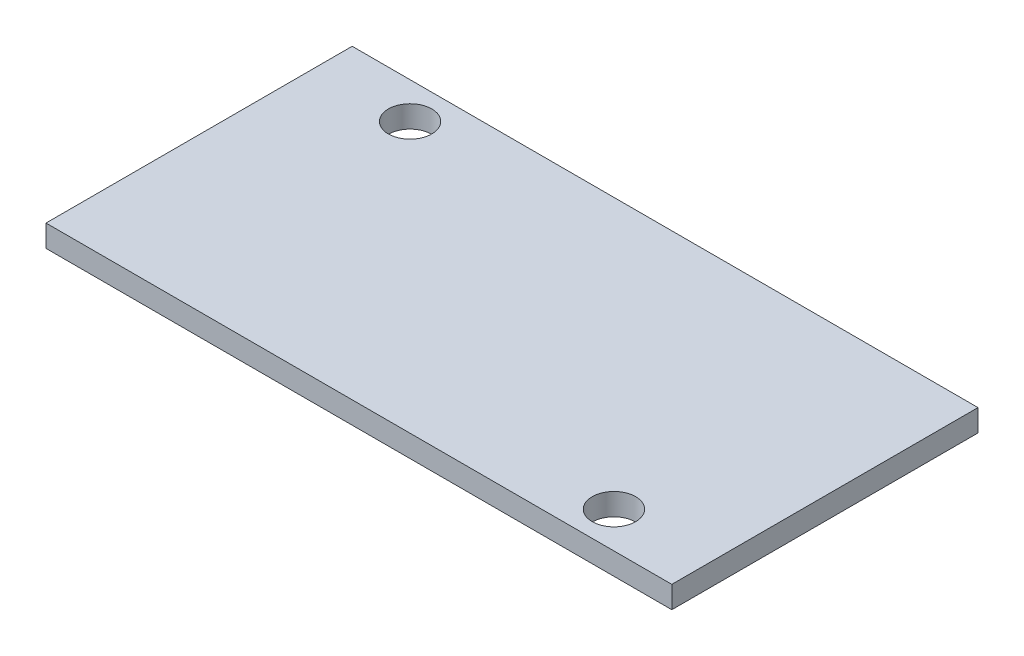
ISO-10303-21;
HEADER;
FILE_DESCRIPTION(('STEP AP214'),'2;1');
FILE_NAME('part.step','',(''),(''),'','','');
FILE_SCHEMA(('AUTOMOTIVE_DESIGN { 1 0 10303 214 1 1 1 1 }'));
ENDSEC;
DATA;
#1=APPLICATION_CONTEXT('core data for automotive mechanical design processes');
#2=APPLICATION_PROTOCOL_DEFINITION('international standard','automotive_design',2000,#1);
#3=PRODUCT_CONTEXT('',#1,'mechanical');
#4=PRODUCT('Part','Part','',(#3));
#5=PRODUCT_RELATED_PRODUCT_CATEGORY('part','',(#4));
#6=PRODUCT_DEFINITION_FORMATION('','',#4);
#7=PRODUCT_DEFINITION_CONTEXT('part definition',#1,'design');
#8=PRODUCT_DEFINITION('design','',#6,#7);
#9=PRODUCT_DEFINITION_SHAPE('','',#8);
#10=(LENGTH_UNIT() NAMED_UNIT(*) SI_UNIT(.MILLI.,.METRE.));
#11=(NAMED_UNIT(*) PLANE_ANGLE_UNIT() SI_UNIT($,.RADIAN.));
#12=(NAMED_UNIT(*) SI_UNIT($,.STERADIAN.) SOLID_ANGLE_UNIT());
#13=UNCERTAINTY_MEASURE_WITH_UNIT(LENGTH_MEASURE(1.E-05),#10,'distance_accuracy_value','');
#14=(GEOMETRIC_REPRESENTATION_CONTEXT(3) GLOBAL_UNCERTAINTY_ASSIGNED_CONTEXT((#13)) GLOBAL_UNIT_ASSIGNED_CONTEXT((#10,
#11,#12)) REPRESENTATION_CONTEXT('',''));
#15=CARTESIAN_POINT('',(0.,0.,0.));
#16=DIRECTION('',(0.,0.,1.));
#17=DIRECTION('',(1.,0.,0.));
#18=AXIS2_PLACEMENT_3D('',#15,#16,#17);
#19=CARTESIAN_POINT('',(21.625,1.52,10.58));
#20=DIRECTION('',(-1.,0.,0.));
#21=DIRECTION('',(0.,0.,1.));
#22=AXIS2_PLACEMENT_3D('',#19,#20,#21);
#23=PLANE('',#22);
#24=DIRECTION('',(0.,0.,-1.));
#25=VECTOR('',#24,1.);
#26=CARTESIAN_POINT('',(21.625,0.,10.58));
#27=LINE('',#26,#25);
#28=CARTESIAN_POINT('',(21.625,0.,10.58));
#29=VERTEX_POINT('',#28);
#30=CARTESIAN_POINT('',(21.625,0.,-10.58));
#31=VERTEX_POINT('',#30);
#32=EDGE_CURVE('E100',#29,#31,#27,.T.);
#33=ORIENTED_EDGE('',*,*,#32,.T.);
#34=DIRECTION('',(0.,-1.,0.));
#35=VECTOR('',#34,1.);
#36=CARTESIAN_POINT('',(21.625,1.52,-10.58));
#37=LINE('',#36,#35);
#38=CARTESIAN_POINT('',(21.625,1.52,-10.58));
#39=VERTEX_POINT('',#38);
#40=EDGE_CURVE('E11',#39,#31,#37,.T.);
#41=ORIENTED_EDGE('',*,*,#40,.F.);
#42=DIRECTION('',(0.,0.,-1.));
#43=VECTOR('',#42,1.);
#44=CARTESIAN_POINT('',(21.625,1.52,10.58));
#45=LINE('',#44,#43);
#46=CARTESIAN_POINT('',(21.625,1.52,10.58));
#47=VERTEX_POINT('',#46);
#48=EDGE_CURVE('E88',#47,#39,#45,.T.);
#49=ORIENTED_EDGE('',*,*,#48,.F.);
#50=DIRECTION('',(0.,-1.,0.));
#51=VECTOR('',#50,1.);
#52=CARTESIAN_POINT('',(21.625,1.52,10.58));
#53=LINE('',#52,#51);
#54=EDGE_CURVE('E96',#47,#29,#53,.T.);
#55=ORIENTED_EDGE('',*,*,#54,.T.);
#56=EDGE_LOOP('',(#33,#41,#49,#55));
#57=FACE_BOUND('',#56,.T.);
#58=ADVANCED_FACE('F37',(#57),#23,.F.);
#59=CARTESIAN_POINT('',(-21.625,1.52,-10.58));
#60=DIRECTION('',(0.,0.,1.));
#61=DIRECTION('',(1.,0.,0.));
#62=AXIS2_PLACEMENT_3D('',#59,#60,#61);
#63=PLANE('',#62);
#64=DIRECTION('',(-1.,0.,0.));
#65=VECTOR('',#64,1.);
#66=CARTESIAN_POINT('',(-21.625,0.,-10.58));
#67=LINE('',#66,#65);
#68=CARTESIAN_POINT('',(-21.625,0.,-10.58));
#69=VERTEX_POINT('',#68);
#70=EDGE_CURVE('E92',#31,#69,#67,.T.);
#71=ORIENTED_EDGE('',*,*,#70,.T.);
#72=DIRECTION('',(0.,-1.,0.));
#73=VECTOR('',#72,1.);
#74=CARTESIAN_POINT('',(-21.625,1.52,-10.58));
#75=LINE('',#74,#73);
#76=CARTESIAN_POINT('',(-21.625,1.52,-10.58));
#77=VERTEX_POINT('',#76);
#78=EDGE_CURVE('E45',#77,#69,#75,.T.);
#79=ORIENTED_EDGE('',*,*,#78,.F.);
#80=DIRECTION('',(-1.,0.,0.));
#81=VECTOR('',#80,1.);
#82=CARTESIAN_POINT('',(-21.625,1.52,-10.58));
#83=LINE('',#82,#81);
#84=EDGE_CURVE('E83',#39,#77,#83,.T.);
#85=ORIENTED_EDGE('',*,*,#84,.F.);
#86=ORIENTED_EDGE('',*,*,#40,.T.);
#87=EDGE_LOOP('',(#71,#79,#85,#86));
#88=FACE_BOUND('',#87,.T.);
#89=ADVANCED_FACE('F91',(#88),#63,.F.);
#90=CARTESIAN_POINT('',(-21.625,1.52,10.58));
#91=DIRECTION('',(1.,0.,0.));
#92=DIRECTION('',(0.,0.,-1.));
#93=AXIS2_PLACEMENT_3D('',#90,#91,#92);
#94=PLANE('',#93);
#95=DIRECTION('',(0.,0.,1.));
#96=VECTOR('',#95,1.);
#97=CARTESIAN_POINT('',(-21.625,0.,10.58));
#98=LINE('',#97,#96);
#99=CARTESIAN_POINT('',(-21.625,0.,10.58));
#100=VERTEX_POINT('',#99);
#101=EDGE_CURVE('E70',#69,#100,#98,.T.);
#102=ORIENTED_EDGE('',*,*,#101,.T.);
#103=DIRECTION('',(0.,-1.,0.));
#104=VECTOR('',#103,1.);
#105=CARTESIAN_POINT('',(-21.625,1.52,10.58));
#106=LINE('',#105,#104);
#107=CARTESIAN_POINT('',(-21.625,1.52,10.58));
#108=VERTEX_POINT('',#107);
#109=EDGE_CURVE('E93',#108,#100,#106,.T.);
#110=ORIENTED_EDGE('',*,*,#109,.F.);
#111=DIRECTION('',(0.,0.,1.));
#112=VECTOR('',#111,1.);
#113=CARTESIAN_POINT('',(-21.625,1.52,10.58));
#114=LINE('',#113,#112);
#115=EDGE_CURVE('E86',#77,#108,#114,.T.);
#116=ORIENTED_EDGE('',*,*,#115,.F.);
#117=ORIENTED_EDGE('',*,*,#78,.T.);
#118=EDGE_LOOP('',(#102,#110,#116,#117));
#119=FACE_BOUND('',#118,.T.);
#120=ADVANCED_FACE('F94',(#119),#94,.F.);
#121=CARTESIAN_POINT('',(-21.625,1.52,10.58));
#122=DIRECTION('',(0.,0.,-1.));
#123=DIRECTION('',(-1.,0.,0.));
#124=AXIS2_PLACEMENT_3D('',#121,#122,#123);
#125=PLANE('',#124);
#126=DIRECTION('',(1.,0.,0.));
#127=VECTOR('',#126,1.);
#128=CARTESIAN_POINT('',(-21.625,0.,10.58));
#129=LINE('',#128,#127);
#130=EDGE_CURVE('E76',#100,#29,#129,.T.);
#131=ORIENTED_EDGE('',*,*,#130,.T.);
#132=ORIENTED_EDGE('',*,*,#54,.F.);
#133=DIRECTION('',(1.,0.,0.));
#134=VECTOR('',#133,1.);
#135=CARTESIAN_POINT('',(-21.625,1.52,10.58));
#136=LINE('',#135,#134);
#137=EDGE_CURVE('E53',#108,#47,#136,.T.);
#138=ORIENTED_EDGE('',*,*,#137,.F.);
#139=ORIENTED_EDGE('',*,*,#109,.T.);
#140=EDGE_LOOP('',(#131,#132,#138,#139));
#141=FACE_BOUND('',#140,.T.);
#142=ADVANCED_FACE('F108',(#141),#125,.F.);
#143=CARTESIAN_POINT('',(0.,1.52,0.));
#144=DIRECTION('',(0.,-1.,0.));
#145=DIRECTION('',(0.,0.,-1.));
#146=AXIS2_PLACEMENT_3D('',#143,#144,#145);
#147=PLANE('',#146);
#148=CARTESIAN_POINT('',(-15.125,1.52,-8.08));
#149=DIRECTION('',(0.,1.,0.));
#150=DIRECTION('',(0.,0.,1.));
#151=AXIS2_PLACEMENT_3D('',#148,#149,#150);
#152=CIRCLE('',#151,1.5);
#153=CARTESIAN_POINT('',(-15.125,1.52,-6.58));
#154=VERTEX_POINT('',#153);
#155=EDGE_CURVE('E120',#154,#154,#152,.T.);
#156=ORIENTED_EDGE('',*,*,#155,.F.);
#157=EDGE_LOOP('',(#156));
#158=FACE_BOUND('',#157,.T.);
#159=CARTESIAN_POINT('',(15.125,1.52,8.08));
#160=DIRECTION('',(0.,1.,0.));
#161=DIRECTION('',(0.,0.,1.));
#162=AXIS2_PLACEMENT_3D('',#159,#160,#161);
#163=CIRCLE('',#162,1.5);
#164=CARTESIAN_POINT('',(15.125,1.52,9.58));
#165=VERTEX_POINT('',#164);
#166=EDGE_CURVE('E117',#165,#165,#163,.T.);
#167=ORIENTED_EDGE('',*,*,#166,.F.);
#168=EDGE_LOOP('',(#167));
#169=FACE_BOUND('',#168,.T.);
#170=ORIENTED_EDGE('',*,*,#48,.T.);
#171=ORIENTED_EDGE('',*,*,#84,.T.);
#172=ORIENTED_EDGE('',*,*,#115,.T.);
#173=ORIENTED_EDGE('',*,*,#137,.T.);
#174=EDGE_LOOP('',(#170,#171,#172,#173));
#175=FACE_BOUND('',#174,.T.);
#176=ADVANCED_FACE('F84',(#158,#169,#175),#147,.F.);
#177=CARTESIAN_POINT('',(0.,0.,0.));
#178=DIRECTION('',(0.,-1.,0.));
#179=DIRECTION('',(0.,0.,-1.));
#180=AXIS2_PLACEMENT_3D('',#177,#178,#179);
#181=PLANE('',#180);
#182=CARTESIAN_POINT('',(-15.125,0.,-8.08));
#183=DIRECTION('',(0.,1.,0.));
#184=DIRECTION('',(0.,0.,1.));
#185=AXIS2_PLACEMENT_3D('',#182,#183,#184);
#186=CIRCLE('',#185,1.5);
#187=CARTESIAN_POINT('',(-15.125,0.,-6.58));
#188=VERTEX_POINT('',#187);
#189=EDGE_CURVE('E103',#188,#188,#186,.T.);
#190=ORIENTED_EDGE('',*,*,#189,.T.);
#191=EDGE_LOOP('',(#190));
#192=FACE_BOUND('',#191,.T.);
#193=CARTESIAN_POINT('',(15.125,0.,8.08));
#194=DIRECTION('',(0.,1.,0.));
#195=DIRECTION('',(0.,0.,1.));
#196=AXIS2_PLACEMENT_3D('',#193,#194,#195);
#197=CIRCLE('',#196,1.5);
#198=CARTESIAN_POINT('',(15.125,0.,9.58));
#199=VERTEX_POINT('',#198);
#200=EDGE_CURVE('E114',#199,#199,#197,.T.);
#201=ORIENTED_EDGE('',*,*,#200,.T.);
#202=EDGE_LOOP('',(#201));
#203=FACE_BOUND('',#202,.T.);
#204=ORIENTED_EDGE('',*,*,#32,.F.);
#205=ORIENTED_EDGE('',*,*,#130,.F.);
#206=ORIENTED_EDGE('',*,*,#101,.F.);
#207=ORIENTED_EDGE('',*,*,#70,.F.);
#208=EDGE_LOOP('',(#204,#205,#206,#207));
#209=FACE_BOUND('',#208,.T.);
#210=ADVANCED_FACE('F111',(#192,#203,#209),#181,.T.);
#211=CARTESIAN_POINT('',(15.125,0.,8.08));
#212=DIRECTION('',(0.,1.,0.));
#213=DIRECTION('',(0.,0.,1.));
#214=AXIS2_PLACEMENT_3D('',#211,#212,#213);
#215=CYLINDRICAL_SURFACE('',#214,1.5);
#216=ORIENTED_EDGE('',*,*,#200,.F.);
#217=EDGE_LOOP('',(#216));
#218=FACE_BOUND('',#217,.T.);
#219=ORIENTED_EDGE('',*,*,#166,.T.);
#220=EDGE_LOOP('',(#219));
#221=FACE_BOUND('',#220,.T.);
#222=ADVANCED_FACE('F131',(#218,#221),#215,.F.);
#223=CARTESIAN_POINT('',(-15.125,0.,-8.08));
#224=DIRECTION('',(0.,1.,0.));
#225=DIRECTION('',(0.,0.,1.));
#226=AXIS2_PLACEMENT_3D('',#223,#224,#225);
#227=CYLINDRICAL_SURFACE('',#226,1.5);
#228=ORIENTED_EDGE('',*,*,#189,.F.);
#229=EDGE_LOOP('',(#228));
#230=FACE_BOUND('',#229,.T.);
#231=ORIENTED_EDGE('',*,*,#155,.T.);
#232=EDGE_LOOP('',(#231));
#233=FACE_BOUND('',#232,.T.);
#234=ADVANCED_FACE('F128',(#230,#233),#227,.F.);
#235=CLOSED_SHELL('',(#58,#89,#120,#142,#176,#210,#222,#234));
#236=MANIFOLD_SOLID_BREP('B2',#235);
#237=ADVANCED_BREP_SHAPE_REPRESENTATION('',(#18,#236),#14);
#238=SHAPE_DEFINITION_REPRESENTATION(#9,#237);
ENDSEC;
END-ISO-10303-21;
